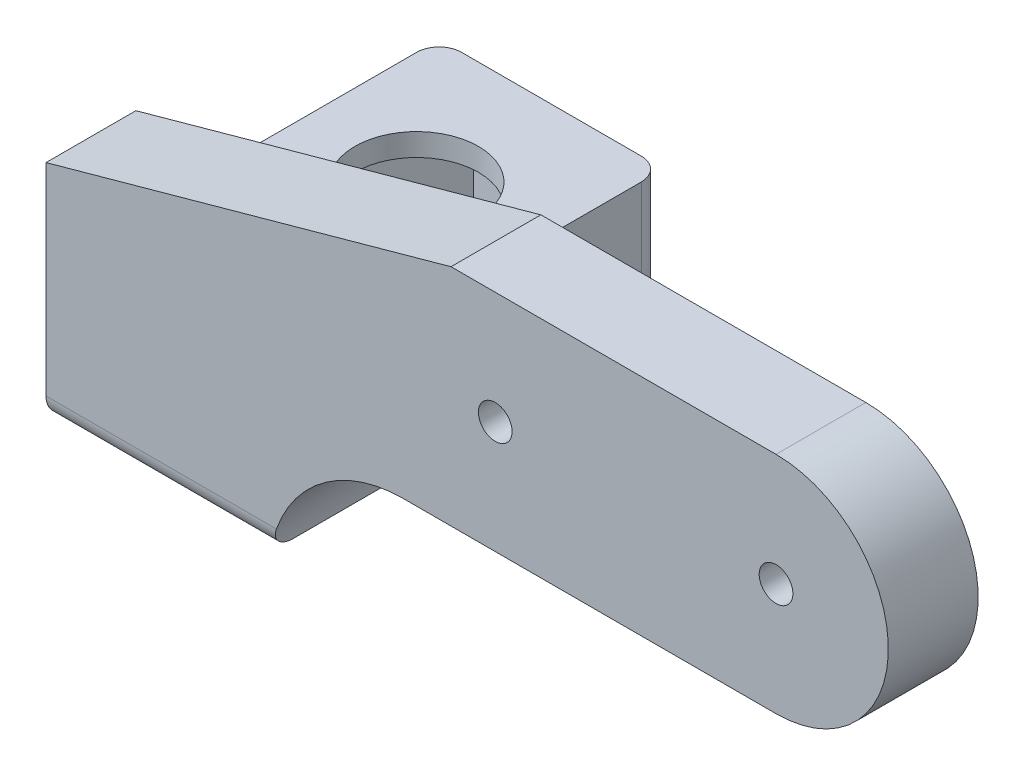
ISO-10303-21;
HEADER;
FILE_DESCRIPTION(('STEP AP214'),'2;1');
FILE_NAME('part.step','',(''),(''),'','','');
FILE_SCHEMA(('AUTOMOTIVE_DESIGN { 1 0 10303 214 1 1 1 1 }'));
ENDSEC;
DATA;
#1=APPLICATION_CONTEXT('core data for automotive mechanical design processes');
#2=APPLICATION_PROTOCOL_DEFINITION('international standard','automotive_design',2000,#1);
#3=PRODUCT_CONTEXT('',#1,'mechanical');
#4=PRODUCT('Part','Part','',(#3));
#5=PRODUCT_RELATED_PRODUCT_CATEGORY('part','',(#4));
#6=PRODUCT_DEFINITION_FORMATION('','',#4);
#7=PRODUCT_DEFINITION_CONTEXT('part definition',#1,'design');
#8=PRODUCT_DEFINITION('design','',#6,#7);
#9=PRODUCT_DEFINITION_SHAPE('','',#8);
#10=(LENGTH_UNIT() NAMED_UNIT(*) SI_UNIT(.MILLI.,.METRE.));
#11=(NAMED_UNIT(*) PLANE_ANGLE_UNIT() SI_UNIT($,.RADIAN.));
#12=(NAMED_UNIT(*) SI_UNIT($,.STERADIAN.) SOLID_ANGLE_UNIT());
#13=UNCERTAINTY_MEASURE_WITH_UNIT(LENGTH_MEASURE(1.E-05),#10,'distance_accuracy_value','');
#14=(GEOMETRIC_REPRESENTATION_CONTEXT(3) GLOBAL_UNCERTAINTY_ASSIGNED_CONTEXT((#13)) GLOBAL_UNIT_ASSIGNED_CONTEXT((#10,
#11,#12)) REPRESENTATION_CONTEXT('',''));
#15=CARTESIAN_POINT('',(0.,0.,0.));
#16=DIRECTION('',(0.,0.,1.));
#17=DIRECTION('',(1.,0.,0.));
#18=AXIS2_PLACEMENT_3D('',#15,#16,#17);
#19=CARTESIAN_POINT('',(40.,0.,0.));
#20=DIRECTION('',(0.,0.,1.));
#21=DIRECTION('',(1.,0.,0.));
#22=AXIS2_PLACEMENT_3D('',#19,#20,#21);
#23=PLANE('',#22);
#24=CARTESIAN_POINT('',(40.,0.,0.));
#25=DIRECTION('',(0.,0.,1.));
#26=DIRECTION('',(1.,0.,0.));
#27=AXIS2_PLACEMENT_3D('',#24,#25,#26);
#28=CIRCLE('',#27,1.5);
#29=CARTESIAN_POINT('',(41.5,0.,0.));
#30=VERTEX_POINT('',#29);
#31=EDGE_CURVE('E210',#30,#30,#28,.T.);
#32=ORIENTED_EDGE('',*,*,#31,.T.);
#33=EDGE_LOOP('',(#32));
#34=FACE_BOUND('',#33,.T.);
#35=CARTESIAN_POINT('',(15.,0.,0.));
#36=DIRECTION('',(0.,0.,-1.));
#37=DIRECTION('',(-1.,0.,0.));
#38=AXIS2_PLACEMENT_3D('',#35,#36,#37);
#39=CIRCLE('',#38,1.5);
#40=CARTESIAN_POINT('',(13.5,0.,0.));
#41=VERTEX_POINT('',#40);
#42=EDGE_CURVE('E320',#41,#41,#39,.T.);
#43=ORIENTED_EDGE('',*,*,#42,.F.);
#44=EDGE_LOOP('',(#43));
#45=FACE_BOUND('',#44,.T.);
#46=DIRECTION('',(0.,-1.,0.));
#47=VECTOR('',#46,1.);
#48=CARTESIAN_POINT('',(-25.,10.,0.));
#49=LINE('',#48,#47);
#50=CARTESIAN_POINT('',(-25.,0.,0.));
#51=VERTEX_POINT('',#50);
#52=CARTESIAN_POINT('',(-25.,-3.,0.));
#53=VERTEX_POINT('',#52);
#54=EDGE_CURVE('E207',#51,#53,#49,.T.);
#55=ORIENTED_EDGE('',*,*,#54,.F.);
#56=DIRECTION('',(0.963636466633251,0.267216691422118,0.));
#57=VECTOR('',#56,1.);
#58=CARTESIAN_POINT('',(35.3586905886521,16.7374836425835,0.));
#59=LINE('',#58,#57);
#60=CARTESIAN_POINT('',(11.061986304254,10.,0.));
#61=VERTEX_POINT('',#60);
#62=EDGE_CURVE('E192',#51,#61,#59,.T.);
#63=ORIENTED_EDGE('',*,*,#62,.T.);
#64=DIRECTION('',(-1.,0.,0.));
#65=VECTOR('',#64,1.);
#66=CARTESIAN_POINT('',(-25.,10.,0.));
#67=LINE('',#66,#65);
#68=CARTESIAN_POINT('',(40.,10.,0.));
#69=VERTEX_POINT('',#68);
#70=EDGE_CURVE('E191',#69,#61,#67,.T.);
#71=ORIENTED_EDGE('',*,*,#70,.F.);
#72=CARTESIAN_POINT('',(40.,0.,0.));
#73=DIRECTION('',(0.,0.,1.));
#74=DIRECTION('',(1.,0.,0.));
#75=AXIS2_PLACEMENT_3D('',#72,#73,#74);
#76=CIRCLE('',#75,10.);
#77=CARTESIAN_POINT('',(40.,-10.,0.));
#78=VERTEX_POINT('',#77);
#79=EDGE_CURVE('E212',#78,#69,#76,.T.);
#80=ORIENTED_EDGE('',*,*,#79,.F.);
#81=DIRECTION('',(1.,0.,0.));
#82=VECTOR('',#81,1.);
#83=CARTESIAN_POINT('',(-25.,-10.,0.));
#84=LINE('',#83,#82);
#85=CARTESIAN_POINT('',(6.83215956619923,-10.,0.));
#86=VERTEX_POINT('',#85);
#87=EDGE_CURVE('E209',#86,#78,#84,.T.);
#88=ORIENTED_EDGE('',*,*,#87,.F.);
#89=CARTESIAN_POINT('',(6.83215956619924,-22.,0.));
#90=DIRECTION('',(0.,0.,1.));
#91=DIRECTION('',(1.,0.,0.));
#92=AXIS2_PLACEMENT_3D('',#89,#90,#91);
#93=CIRCLE('',#92,12.);
#94=CARTESIAN_POINT('',(0.,-12.1348291620473,0.));
#95=VERTEX_POINT('',#94);
#96=EDGE_CURVE('E224',#86,#95,#93,.T.);
#97=ORIENTED_EDGE('',*,*,#96,.T.);
#98=DIRECTION('',(0.,-1.,0.));
#99=VECTOR('',#98,1.);
#100=CARTESIAN_POINT('',(0.,0.,0.));
#101=LINE('',#100,#99);
#102=CARTESIAN_POINT('',(0.,-3.,0.));
#103=VERTEX_POINT('',#102);
#104=EDGE_CURVE('E240',#95,#103,#101,.F.);
#105=ORIENTED_EDGE('',*,*,#104,.T.);
#106=DIRECTION('',(1.,0.,0.));
#107=VECTOR('',#106,1.);
#108=CARTESIAN_POINT('',(-25.,-3.,0.));
#109=LINE('',#108,#107);
#110=EDGE_CURVE('E237',#103,#53,#109,.F.);
#111=ORIENTED_EDGE('',*,*,#110,.T.);
#112=EDGE_LOOP('',(#55,#63,#71,#80,#88,#97,#105,#111));
#113=FACE_BOUND('',#112,.T.);
#114=ADVANCED_FACE('F33',(#34,#45,#113),#23,.F.);
#115=CARTESIAN_POINT('',(-25.,10.,8.));
#116=DIRECTION('',(1.,0.,0.));
#117=DIRECTION('',(0.,1.,0.));
#118=AXIS2_PLACEMENT_3D('',#115,#116,#117);
#119=PLANE('',#118);
#120=DIRECTION('',(0.,0.,1.));
#121=VECTOR('',#120,1.);
#122=CARTESIAN_POINT('',(-25.,-8.,-30.));
#123=LINE('',#122,#121);
#124=CARTESIAN_POINT('',(-25.,-8.,-25.));
#125=VERTEX_POINT('',#124);
#126=CARTESIAN_POINT('',(-25.,-8.,-5.));
#127=VERTEX_POINT('',#126);
#128=EDGE_CURVE('E314',#125,#127,#123,.T.);
#129=ORIENTED_EDGE('',*,*,#128,.F.);
#130=DIRECTION('',(0.,-1.,0.));
#131=VECTOR('',#130,1.);
#132=CARTESIAN_POINT('',(-25.,10.,-25.));
#133=LINE('',#132,#131);
#134=CARTESIAN_POINT('',(-25.,-20.,-25.));
#135=VERTEX_POINT('',#134);
#136=EDGE_CURVE('E11',#125,#135,#133,.T.);
#137=ORIENTED_EDGE('',*,*,#136,.T.);
#138=DIRECTION('',(0.,0.,-1.));
#139=VECTOR('',#138,1.);
#140=CARTESIAN_POINT('',(-25.,-20.,8.));
#141=LINE('',#140,#139);
#142=CARTESIAN_POINT('',(-25.,-20.,6.));
#143=VERTEX_POINT('',#142);
#144=EDGE_CURVE('E316',#143,#135,#141,.T.);
#145=ORIENTED_EDGE('',*,*,#144,.F.);
#146=CARTESIAN_POINT('',(-25.,-18.,6.));
#147=DIRECTION('',(1.,0.,0.));
#148=DIRECTION('',(0.,1.,0.));
#149=AXIS2_PLACEMENT_3D('',#146,#147,#148);
#150=CIRCLE('',#149,2.);
#151=CARTESIAN_POINT('',(-25.,-18.,8.));
#152=VERTEX_POINT('',#151);
#153=EDGE_CURVE('E630',#143,#152,#150,.F.);
#154=ORIENTED_EDGE('',*,*,#153,.T.);
#155=DIRECTION('',(0.,-1.,0.));
#156=VECTOR('',#155,1.);
#157=CARTESIAN_POINT('',(-25.,10.,8.));
#158=LINE('',#157,#156);
#159=CARTESIAN_POINT('',(-25.,0.,8.));
#160=VERTEX_POINT('',#159);
#161=EDGE_CURVE('E214',#160,#152,#158,.T.);
#162=ORIENTED_EDGE('',*,*,#161,.F.);
#163=DIRECTION('',(0.,0.,1.));
#164=VECTOR('',#163,1.);
#165=CARTESIAN_POINT('',(-25.,0.,-2.));
#166=LINE('',#165,#164);
#167=EDGE_CURVE('E178',#51,#160,#166,.T.);
#168=ORIENTED_EDGE('',*,*,#167,.F.);
#169=ORIENTED_EDGE('',*,*,#54,.T.);
#170=CARTESIAN_POINT('',(-25.,-3.,-5.));
#171=DIRECTION('',(1.,0.,0.));
#172=DIRECTION('',(0.,1.,0.));
#173=AXIS2_PLACEMENT_3D('',#170,#171,#172);
#174=CIRCLE('',#173,5.);
#175=EDGE_CURVE('E252',#53,#127,#174,.T.);
#176=ORIENTED_EDGE('',*,*,#175,.T.);
#177=EDGE_LOOP('',(#129,#137,#145,#154,#162,#168,#169,#176));
#178=FACE_BOUND('',#177,.T.);
#179=ADVANCED_FACE('F429',(#178),#119,.F.);
#180=CARTESIAN_POINT('',(-25.,-10.,8.));
#181=DIRECTION('',(0.,1.,0.));
#182=DIRECTION('',(0.,0.,1.));
#183=AXIS2_PLACEMENT_3D('',#180,#181,#182);
#184=PLANE('',#183);
#185=DIRECTION('',(1.,0.,0.));
#186=VECTOR('',#185,1.);
#187=CARTESIAN_POINT('',(-25.,-10.,8.));
#188=LINE('',#187,#186);
#189=CARTESIAN_POINT('',(6.83215956619923,-10.,8.));
#190=VERTEX_POINT('',#189);
#191=CARTESIAN_POINT('',(40.,-10.,8.));
#192=VERTEX_POINT('',#191);
#193=EDGE_CURVE('E203',#190,#192,#188,.T.);
#194=ORIENTED_EDGE('',*,*,#193,.F.);
#195=DIRECTION('',(0.,0.,-1.));
#196=VECTOR('',#195,1.);
#197=CARTESIAN_POINT('',(6.83215956619923,-10.,8.));
#198=LINE('',#197,#196);
#199=EDGE_CURVE('E218',#190,#86,#198,.T.);
#200=ORIENTED_EDGE('',*,*,#199,.T.);
#201=ORIENTED_EDGE('',*,*,#87,.T.);
#202=DIRECTION('',(0.,0.,-1.));
#203=VECTOR('',#202,1.);
#204=CARTESIAN_POINT('',(40.,-10.,8.));
#205=LINE('',#204,#203);
#206=EDGE_CURVE('E201',#192,#78,#205,.T.);
#207=ORIENTED_EDGE('',*,*,#206,.F.);
#208=EDGE_LOOP('',(#194,#200,#201,#207));
#209=FACE_BOUND('',#208,.T.);
#210=ADVANCED_FACE('F333',(#209),#184,.F.);
#211=CARTESIAN_POINT('',(40.,0.,8.));
#212=DIRECTION('',(0.,0.,-1.));
#213=DIRECTION('',(-1.,0.,0.));
#214=AXIS2_PLACEMENT_3D('',#211,#212,#213);
#215=CYLINDRICAL_SURFACE('',#214,10.);
#216=ORIENTED_EDGE('',*,*,#79,.T.);
#217=DIRECTION('',(0.,0.,-1.));
#218=VECTOR('',#217,1.);
#219=CARTESIAN_POINT('',(40.,10.,8.));
#220=LINE('',#219,#218);
#221=CARTESIAN_POINT('',(40.,10.,8.));
#222=VERTEX_POINT('',#221);
#223=EDGE_CURVE('E199',#222,#69,#220,.T.);
#224=ORIENTED_EDGE('',*,*,#223,.F.);
#225=CARTESIAN_POINT('',(40.,0.,8.));
#226=DIRECTION('',(0.,0.,1.));
#227=DIRECTION('',(1.,0.,0.));
#228=AXIS2_PLACEMENT_3D('',#225,#226,#227);
#229=CIRCLE('',#228,10.);
#230=EDGE_CURVE('E197',#192,#222,#229,.T.);
#231=ORIENTED_EDGE('',*,*,#230,.F.);
#232=ORIENTED_EDGE('',*,*,#206,.T.);
#233=EDGE_LOOP('',(#216,#224,#231,#232));
#234=FACE_BOUND('',#233,.T.);
#235=ADVANCED_FACE('F337',(#234),#215,.T.);
#236=CARTESIAN_POINT('',(-25.,10.,8.));
#237=DIRECTION('',(0.,-1.,0.));
#238=DIRECTION('',(0.,0.,-1.));
#239=AXIS2_PLACEMENT_3D('',#236,#237,#238);
#240=PLANE('',#239);
#241=ORIENTED_EDGE('',*,*,#70,.T.);
#242=DIRECTION('',(0.,0.,1.));
#243=VECTOR('',#242,1.);
#244=CARTESIAN_POINT('',(11.061986304254,10.,-2.));
#245=LINE('',#244,#243);
#246=CARTESIAN_POINT('',(11.061986304254,10.,8.));
#247=VERTEX_POINT('',#246);
#248=EDGE_CURVE('E175',#61,#247,#245,.T.);
#249=ORIENTED_EDGE('',*,*,#248,.T.);
#250=DIRECTION('',(-1.,0.,0.));
#251=VECTOR('',#250,1.);
#252=CARTESIAN_POINT('',(-25.,10.,8.));
#253=LINE('',#252,#251);
#254=EDGE_CURVE('E189',#222,#247,#253,.T.);
#255=ORIENTED_EDGE('',*,*,#254,.F.);
#256=ORIENTED_EDGE('',*,*,#223,.T.);
#257=EDGE_LOOP('',(#241,#249,#255,#256));
#258=FACE_BOUND('',#257,.T.);
#259=ADVANCED_FACE('F187',(#258),#240,.F.);
#260=CARTESIAN_POINT('',(40.,0.,8.));
#261=DIRECTION('',(0.,0.,1.));
#262=DIRECTION('',(1.,0.,0.));
#263=AXIS2_PLACEMENT_3D('',#260,#261,#262);
#264=PLANE('',#263);
#265=DIRECTION('',(0.963636466633251,0.267216691422118,0.));
#266=VECTOR('',#265,1.);
#267=CARTESIAN_POINT('',(-25.,0.,8.));
#268=LINE('',#267,#266);
#269=EDGE_CURVE('E172',#160,#247,#268,.T.);
#270=ORIENTED_EDGE('',*,*,#269,.F.);
#271=ORIENTED_EDGE('',*,*,#161,.T.);
#272=DIRECTION('',(-1.,0.,0.));
#273=VECTOR('',#272,1.);
#274=CARTESIAN_POINT('',(40.,-18.,8.));
#275=LINE('',#274,#273);
#276=CARTESIAN_POINT('',(-4.48154893278553,-18.,8.));
#277=VERTEX_POINT('',#276);
#278=EDGE_CURVE('E281',#152,#277,#275,.F.);
#279=ORIENTED_EDGE('',*,*,#278,.T.);
#280=CARTESIAN_POINT('',(6.83215956619924,-22.,8.));
#281=DIRECTION('',(0.,0.,1.));
#282=DIRECTION('',(1.,0.,0.));
#283=AXIS2_PLACEMENT_3D('',#280,#281,#282);
#284=CIRCLE('',#283,12.);
#285=EDGE_CURVE('E227',#277,#190,#284,.F.);
#286=ORIENTED_EDGE('',*,*,#285,.T.);
#287=ORIENTED_EDGE('',*,*,#193,.T.);
#288=ORIENTED_EDGE('',*,*,#230,.T.);
#289=ORIENTED_EDGE('',*,*,#254,.T.);
#290=EDGE_LOOP('',(#270,#271,#279,#286,#287,#288,#289));
#291=FACE_BOUND('',#290,.T.);
#292=CARTESIAN_POINT('',(15.,0.,8.));
#293=DIRECTION('',(0.,0.,1.));
#294=DIRECTION('',(1.,0.,0.));
#295=AXIS2_PLACEMENT_3D('',#292,#293,#294);
#296=CIRCLE('',#295,1.5);
#297=CARTESIAN_POINT('',(16.5,0.,8.));
#298=VERTEX_POINT('',#297);
#299=EDGE_CURVE('E323',#298,#298,#296,.T.);
#300=ORIENTED_EDGE('',*,*,#299,.F.);
#301=EDGE_LOOP('',(#300));
#302=FACE_BOUND('',#301,.T.);
#303=CARTESIAN_POINT('',(40.,0.,8.));
#304=DIRECTION('',(0.,0.,1.));
#305=DIRECTION('',(1.,0.,0.));
#306=AXIS2_PLACEMENT_3D('',#303,#304,#305);
#307=CIRCLE('',#306,1.5);
#308=CARTESIAN_POINT('',(41.5,0.,8.));
#309=VERTEX_POINT('',#308);
#310=EDGE_CURVE('E221',#309,#309,#307,.T.);
#311=ORIENTED_EDGE('',*,*,#310,.F.);
#312=EDGE_LOOP('',(#311));
#313=FACE_BOUND('',#312,.T.);
#314=ADVANCED_FACE('F194',(#291,#302,#313),#264,.T.);
#315=CARTESIAN_POINT('',(40.,0.,-2.));
#316=DIRECTION('',(0.,0.,1.));
#317=DIRECTION('',(1.,0.,0.));
#318=AXIS2_PLACEMENT_3D('',#315,#316,#317);
#319=CYLINDRICAL_SURFACE('',#318,1.5);
#320=ORIENTED_EDGE('',*,*,#310,.T.);
#321=EDGE_LOOP('',(#320));
#322=FACE_BOUND('',#321,.T.);
#323=ORIENTED_EDGE('',*,*,#31,.F.);
#324=EDGE_LOOP('',(#323));
#325=FACE_BOUND('',#324,.T.);
#326=ADVANCED_FACE('F472',(#322,#325),#319,.F.);
#327=CARTESIAN_POINT('',(15.,0.,10.));
#328=DIRECTION('',(0.,0.,-1.));
#329=DIRECTION('',(-1.,0.,0.));
#330=AXIS2_PLACEMENT_3D('',#327,#328,#329);
#331=CYLINDRICAL_SURFACE('',#330,1.5);
#332=ORIENTED_EDGE('',*,*,#299,.T.);
#333=EDGE_LOOP('',(#332));
#334=FACE_BOUND('',#333,.T.);
#335=ORIENTED_EDGE('',*,*,#42,.T.);
#336=EDGE_LOOP('',(#335));
#337=FACE_BOUND('',#336,.T.);
#338=ADVANCED_FACE('F481',(#334,#337),#331,.F.);
#339=CARTESIAN_POINT('',(-25.,-20.,8.));
#340=DIRECTION('',(0.,-1.,0.));
#341=DIRECTION('',(1.,0.,0.));
#342=AXIS2_PLACEMENT_3D('',#339,#340,#341);
#343=PLANE('',#342);
#344=DIRECTION('',(-1.,0.,0.));
#345=VECTOR('',#344,1.);
#346=CARTESIAN_POINT('',(-25.,-20.,-27.));
#347=LINE('',#346,#345);
#348=CARTESIAN_POINT('',(-7.,-20.,-27.));
#349=VERTEX_POINT('',#348);
#350=CARTESIAN_POINT('',(-23.,-20.,-27.));
#351=VERTEX_POINT('',#350);
#352=EDGE_CURVE('E182',#349,#351,#347,.T.);
#353=ORIENTED_EDGE('',*,*,#352,.F.);
#354=CARTESIAN_POINT('',(-7.,-20.,-25.));
#355=DIRECTION('',(0.,-1.,0.));
#356=DIRECTION('',(1.,0.,0.));
#357=AXIS2_PLACEMENT_3D('',#354,#355,#356);
#358=CIRCLE('',#357,2.);
#359=CARTESIAN_POINT('',(-5.,-20.,-25.));
#360=VERTEX_POINT('',#359);
#361=EDGE_CURVE('E291',#349,#360,#358,.T.);
#362=ORIENTED_EDGE('',*,*,#361,.T.);
#363=DIRECTION('',(0.,0.,-1.));
#364=VECTOR('',#363,1.);
#365=CARTESIAN_POINT('',(-5.,-20.,8.));
#366=LINE('',#365,#364);
#367=CARTESIAN_POINT('',(-5.,-20.,-5.));
#368=VERTEX_POINT('',#367);
#369=EDGE_CURVE('E310',#368,#360,#366,.T.);
#370=ORIENTED_EDGE('',*,*,#369,.F.);
#371=CARTESIAN_POINT('',(-5.,-20.,6.));
#372=VERTEX_POINT('',#371);
#373=EDGE_CURVE('E313',#372,#368,#366,.T.);
#374=ORIENTED_EDGE('',*,*,#373,.F.);
#375=DIRECTION('',(-1.,0.,0.));
#376=VECTOR('',#375,1.);
#377=CARTESIAN_POINT('',(-25.,-20.,6.));
#378=LINE('',#377,#376);
#379=EDGE_CURVE('E628',#372,#143,#378,.T.);
#380=ORIENTED_EDGE('',*,*,#379,.T.);
#381=ORIENTED_EDGE('',*,*,#144,.T.);
#382=CARTESIAN_POINT('',(-23.,-20.,-25.));
#383=DIRECTION('',(0.,-1.,0.));
#384=DIRECTION('',(1.,0.,0.));
#385=AXIS2_PLACEMENT_3D('',#382,#383,#384);
#386=CIRCLE('',#385,2.);
#387=EDGE_CURVE('E289',#135,#351,#386,.T.);
#388=ORIENTED_EDGE('',*,*,#387,.T.);
#389=EDGE_LOOP('',(#353,#362,#370,#374,#380,#381,#388));
#390=FACE_BOUND('',#389,.T.);
#391=DIRECTION('',(-0.642787609686542,0.,0.766044443118976));
#392=VECTOR('',#391,1.);
#393=CARTESIAN_POINT('',(-6.62913409939624,-20.,-13.5239904898311));
#394=LINE('',#393,#392);
#395=CARTESIAN_POINT('',(-6.62913409939624,-20.,-13.5239904898311));
#396=VERTEX_POINT('',#395);
#397=CARTESIAN_POINT('',(-12.0928287817318,-20.,-7.01261272331977));
#398=VERTEX_POINT('',#397);
#399=EDGE_CURVE('E233',#396,#398,#394,.T.);
#400=ORIENTED_EDGE('',*,*,#399,.F.);
#401=DIRECTION('',(0.342020143325665,0.,0.93969262078591));
#402=VECTOR('',#401,1.);
#403=CARTESIAN_POINT('',(-9.5363053176644,-20.,-21.5113777665113));
#404=LINE('',#403,#402);
#405=CARTESIAN_POINT('',(-9.5363053176644,-20.,-21.5113777665113));
#406=VERTEX_POINT('',#405);
#407=EDGE_CURVE('E351',#406,#396,#404,.T.);
#408=ORIENTED_EDGE('',*,*,#407,.F.);
#409=DIRECTION('',(0.984807753012208,0.,0.173648177666933));
#410=VECTOR('',#409,1.);
#411=CARTESIAN_POINT('',(-17.9071712182682,-20.,-22.9873872766802));
#412=LINE('',#411,#410);
#413=CARTESIAN_POINT('',(-17.9071712182682,-20.,-22.9873872766802));
#414=VERTEX_POINT('',#413);
#415=EDGE_CURVE('E377',#414,#406,#412,.T.);
#416=ORIENTED_EDGE('',*,*,#415,.F.);
#417=DIRECTION('',(0.642787609686542,0.,-0.766044443118976));
#418=VECTOR('',#417,1.);
#419=CARTESIAN_POINT('',(-23.3708659006038,-20.,-16.4760095101689));
#420=LINE('',#419,#418);
#421=CARTESIAN_POINT('',(-23.3708659006038,-20.,-16.4760095101689));
#422=VERTEX_POINT('',#421);
#423=EDGE_CURVE('E374',#422,#414,#420,.T.);
#424=ORIENTED_EDGE('',*,*,#423,.F.);
#425=DIRECTION('',(-0.342020143325665,0.,-0.939692620785909));
#426=VECTOR('',#425,1.);
#427=CARTESIAN_POINT('',(-20.4636946823356,-20.,-8.4886222334887));
#428=LINE('',#427,#426);
#429=CARTESIAN_POINT('',(-20.4636946823356,-20.,-8.4886222334887));
#430=VERTEX_POINT('',#429);
#431=EDGE_CURVE('E371',#430,#422,#428,.T.);
#432=ORIENTED_EDGE('',*,*,#431,.F.);
#433=DIRECTION('',(-0.984807753012207,0.,-0.173648177666934));
#434=VECTOR('',#433,1.);
#435=CARTESIAN_POINT('',(-12.0928287817318,-20.,-7.01261272331977));
#436=LINE('',#435,#434);
#437=EDGE_CURVE('E368',#398,#430,#436,.T.);
#438=ORIENTED_EDGE('',*,*,#437,.F.);
#439=EDGE_LOOP('',(#400,#408,#416,#424,#432,#438));
#440=FACE_BOUND('',#439,.T.);
#441=ADVANCED_FACE('F307',(#390,#440),#343,.T.);
#442=CARTESIAN_POINT('',(-5.,-10.,8.));
#443=DIRECTION('',(1.,0.,0.));
#444=DIRECTION('',(0.,0.,-1.));
#445=AXIS2_PLACEMENT_3D('',#442,#443,#444);
#446=PLANE('',#445);
#447=ORIENTED_EDGE('',*,*,#369,.T.);
#448=DIRECTION('',(0.,-1.,0.));
#449=VECTOR('',#448,1.);
#450=CARTESIAN_POINT('',(-5.,-8.,-25.));
#451=LINE('',#450,#449);
#452=CARTESIAN_POINT('',(-5.,-8.,-25.));
#453=VERTEX_POINT('',#452);
#454=EDGE_CURVE('E56',#360,#453,#451,.F.);
#455=ORIENTED_EDGE('',*,*,#454,.T.);
#456=DIRECTION('',(0.,0.,-1.));
#457=VECTOR('',#456,1.);
#458=CARTESIAN_POINT('',(-5.,-8.,-30.));
#459=LINE('',#458,#457);
#460=CARTESIAN_POINT('',(-5.,-8.,-5.));
#461=VERTEX_POINT('',#460);
#462=EDGE_CURVE('E297',#461,#453,#459,.T.);
#463=ORIENTED_EDGE('',*,*,#462,.F.);
#464=DIRECTION('',(0.,-1.,0.));
#465=VECTOR('',#464,1.);
#466=CARTESIAN_POINT('',(-5.,-10.,-5.));
#467=LINE('',#466,#465);
#468=EDGE_CURVE('E229',#461,#368,#467,.T.);
#469=ORIENTED_EDGE('',*,*,#468,.T.);
#470=EDGE_LOOP('',(#447,#455,#463,#469));
#471=FACE_BOUND('',#470,.T.);
#472=ADVANCED_FACE('F311',(#471),#446,.T.);
#473=CARTESIAN_POINT('',(6.83215956619924,-22.,8.));
#474=DIRECTION('',(0.,0.,-1.));
#475=DIRECTION('',(-1.,0.,0.));
#476=AXIS2_PLACEMENT_3D('',#473,#474,#475);
#477=CYLINDRICAL_SURFACE('',#476,12.);
#478=ORIENTED_EDGE('',*,*,#285,.F.);
#479=CARTESIAN_POINT('',(-4.48154893278553,-18.,8.));
#480=CARTESIAN_POINT('',(-4.50138125313948,-18.0560877717623,7.99999832305192));
#481=CARTESIAN_POINT('',(-4.52078424019849,-18.1123031979097,7.99763882394037));
#482=CARTESIAN_POINT('',(-4.55864154941412,-18.2246643135857,7.98814251719226));
#483=CARTESIAN_POINT('',(-4.57709563531679,-18.2808099823833,7.98100452596653));
#484=CARTESIAN_POINT('',(-4.63089238189496,-18.4486356009318,7.95232807713334));
#485=CARTESIAN_POINT('',(-4.66466130278686,-18.559680833343,7.92352709442766));
#486=CARTESIAN_POINT('',(-4.72735408814331,-18.7765785860345,7.84667328021879));
#487=CARTESIAN_POINT('',(-4.7562683096932,-18.8824204829235,7.79858276083968));
#488=CARTESIAN_POINT('',(-4.80888524868177,-19.0850345721453,7.68410594838005));
#489=CARTESIAN_POINT('',(-4.8325930659608,-19.1818155860983,7.61773770389394));
#490=CARTESIAN_POINT('',(-4.87405212171451,-19.3594265529934,7.47129257380848));
#491=CARTESIAN_POINT('',(-4.89199696991578,-19.4407259787916,7.39183921718088));
#492=CARTESIAN_POINT('',(-4.92339777930131,-19.5890591318635,7.21975075455985));
#493=CARTESIAN_POINT('',(-4.93685253648592,-19.6560890310796,7.12711212247243));
#494=CARTESIAN_POINT('',(-4.95935046191041,-19.772062493677,6.93390339662555));
#495=CARTESIAN_POINT('',(-4.96849692689365,-19.8214219011766,6.83359426728588));
#496=CARTESIAN_POINT('',(-4.98322858152512,-19.902781623108,6.62596324805298));
#497=CARTESIAN_POINT('',(-4.98881654519301,-19.9347954563216,6.51864689275829));
#498=CARTESIAN_POINT('',(-4.99519390458775,-19.9717226972868,6.34212747261345));
#499=CARTESIAN_POINT('',(-4.99700177862493,-19.9823210790566,6.27409656410973));
#500=CARTESIAN_POINT('',(-4.99940140648305,-19.9964577732676,6.13738714644132));
#501=CARTESIAN_POINT('',(-4.99999497922922,-20.0000066450736,6.06870976091195));
#502=CARTESIAN_POINT('',(-5.,-20.,6.));
#503=B_SPLINE_CURVE_WITH_KNOTS('',3,(#479,#480,#481,#482,#483,#484,#485,#486,#487,#488,#489,
#490,#491,#492,#493,#494,#495,#496,#497,#498,#499,#500,#501,#502),.UNSPECIFIED.,.F.,.F.,(4,2,2,
2,2,2,2,2,2,2,2,4),(0.,0.17837527524822,0.356794748790082,0.713707003854084,1.07132001712111,
1.42858115883977,1.7721376621222,2.11578621480146,2.45071320477386,2.78537878270886,
2.99165964856607,3.19763129543271),.UNSPECIFIED.);
#504=EDGE_CURVE('E273',#277,#372,#503,.T.);
#505=ORIENTED_EDGE('',*,*,#504,.T.);
#506=ORIENTED_EDGE('',*,*,#373,.T.);
#507=CARTESIAN_POINT('',(-5.,-20.,-5.));
#508=CARTESIAN_POINT('',(-5.00002983071516,-20.0002423652182,-4.94276954902935));
#509=CARTESIAN_POINT('',(-4.99901934267985,-19.9941907321539,-4.88595530761524));
#510=CARTESIAN_POINT('',(-4.99525039157633,-19.9720554020881,-4.77555185338585));
#511=CARTESIAN_POINT('',(-4.99252898286227,-19.9561844798837,-4.72192001648874));
#512=CARTESIAN_POINT('',(-4.98408791010207,-19.90785267169,-4.59418000961095));
#513=CARTESIAN_POINT('',(-4.97756841164664,-19.8711330466681,-4.52180614517529));
#514=CARTESIAN_POINT('',(-4.96223202410665,-19.7877219107002,-4.3825808930968));
#515=CARTESIAN_POINT('',(-4.95339017335325,-19.7409231136344,-4.31580059752893));
#516=CARTESIAN_POINT('',(-4.92774697062384,-19.6101574112571,-4.14638742167474));
#517=CARTESIAN_POINT('',(-4.90944657037671,-19.5213908358724,-4.04776496875074));
#518=CARTESIAN_POINT('',(-4.86890013634191,-19.336487127318,-3.85845009250445));
#519=CARTESIAN_POINT('',(-4.8466436889024,-19.2403309309494,-3.76777956580897));
#520=CARTESIAN_POINT('',(-4.79843003565541,-19.0437085450451,-3.59166124125073));
#521=CARTESIAN_POINT('',(-4.7724617061297,-18.9432300591574,-3.50623028658098));
#522=CARTESIAN_POINT('',(-4.71703917712112,-18.7400762924599,-3.33950703775577));
#523=CARTESIAN_POINT('',(-4.68758913168601,-18.6374037469055,-3.2582099738707));
#524=CARTESIAN_POINT('',(-4.61901325405676,-18.4100985902356,-3.08290445499588));
#525=CARTESIAN_POINT('',(-4.57912825037921,-18.2851624051574,-2.98958644310515));
#526=CARTESIAN_POINT('',(-4.49437716998494,-18.034255935153,-2.80666530000505));
#527=CARTESIAN_POINT('',(-4.44951033121737,-17.9082854947577,-2.71706274002012));
#528=CARTESIAN_POINT('',(-4.30730488015702,-17.5295368759611,-2.4530012696897));
#529=CARTESIAN_POINT('',(-4.2024203561827,-17.2761195498434,-2.28343795798222));
#530=CARTESIAN_POINT('',(-3.9722913836724,-16.7711556777164,-1.95686688191674));
#531=CARTESIAN_POINT('',(-3.84708080936692,-16.5196067351079,-1.79983886555038));
#532=CARTESIAN_POINT('',(-3.57558827900187,-16.0200735556958,-1.49911766184629));
#533=CARTESIAN_POINT('',(-3.4293185993765,-15.7720873339923,-1.35541678512763));
#534=CARTESIAN_POINT('',(-3.14961065204293,-15.335473435628,-1.11332897815827));
#535=CARTESIAN_POINT('',(-3.0204258322933,-15.1457864250495,-1.01192702679406));
#536=CARTESIAN_POINT('',(-2.7485294155333,-14.7706115192609,-0.819893533912961));
#537=CARTESIAN_POINT('',(-2.60581660491877,-14.5851240026428,-0.729262960349702));
#538=CARTESIAN_POINT('',(-2.30728539567637,-14.2201589955088,-0.560890363369335));
#539=CARTESIAN_POINT('',(-2.15151761366808,-14.0406617508639,-0.483101744511609));
#540=CARTESIAN_POINT('',(-1.82648848948985,-13.6882485401282,-0.342179324884258));
#541=CARTESIAN_POINT('',(-1.65723183331395,-13.5153303190805,-0.279040464390576));
#542=CARTESIAN_POINT('',(-1.36841508496078,-13.2378560430232,-0.189444479936658));
#543=CARTESIAN_POINT('',(-1.25267734182957,-13.1309270879083,-0.157938067629622));
#544=CARTESIAN_POINT('',(-1.01604778268768,-12.9208668537399,-0.102817284378438));
#545=CARTESIAN_POINT('',(-0.895157979504437,-12.8177341203861,-0.0791998626316512));
#546=CARTESIAN_POINT('',(-0.647824429568627,-12.6151449323776,-0.0405569345325324));
#547=CARTESIAN_POINT('',(-0.521353323286093,-12.5157123550073,-0.0255803859630951));
#548=CARTESIAN_POINT('',(-0.263900565394985,-12.32156759435,-0.00529847183239202));
#549=CARTESIAN_POINT('',(-0.132914578924757,-12.2268601740619,-2.6803381606355E-06));
#550=CARTESIAN_POINT('',(0.,-12.1348291620473,0.));
#551=B_SPLINE_CURVE_WITH_KNOTS('',3,(#507,#508,#509,#510,#511,#512,#513,#514,#515,#516,#517,
#518,#519,#520,#521,#522,#523,#524,#525,#526,#527,#528,#529,#530,#531,#532,#533,#534,#535,#536,
#537,#538,#539,#540,#541,#542,#543,#544,#545,#546,#547,#548,#549,#550),.UNSPECIFIED.,.F.,.F.,(4,
2,2,2,2,2,2,2,2,2,2,2,2,2,2,2,2,2,2,2,2,4),(0.,0.170703151596656,0.337830952092287,
0.580693490649767,0.826281587637511,1.22705914658555,1.62890774734898,2.03198688396057,
2.43458986869146,2.91732242315391,3.40012892122403,4.3665052326105,5.33128726545324,
6.29550913757507,7.04766010365497,7.79987860962329,8.54930476127781,9.29847169003779,
9.78026574132661,10.2618732586285,10.7461833470875,11.2309721495371),.UNSPECIFIED.);
#552=EDGE_CURVE('E244',#368,#95,#551,.T.);
#553=ORIENTED_EDGE('',*,*,#552,.T.);
#554=ORIENTED_EDGE('',*,*,#96,.F.);
#555=ORIENTED_EDGE('',*,*,#199,.F.);
#556=EDGE_LOOP('',(#478,#505,#506,#553,#554,#555));
#557=FACE_BOUND('',#556,.T.);
#558=ADVANCED_FACE('F254',(#557),#477,.F.);
#559=CARTESIAN_POINT('',(0.,-8.,0.));
#560=DIRECTION('',(0.,-1.,0.));
#561=DIRECTION('',(1.,0.,0.));
#562=AXIS2_PLACEMENT_3D('',#559,#560,#561);
#563=PLANE('',#562);
#564=CARTESIAN_POINT('',(-15.,-8.,-15.));
#565=DIRECTION('',(0.,-1.,0.));
#566=DIRECTION('',(1.,0.,0.));
#567=AXIS2_PLACEMENT_3D('',#564,#565,#566);
#568=CIRCLE('',#567,5.5);
#569=CARTESIAN_POINT('',(-9.5,-8.,-15.));
#570=VERTEX_POINT('',#569);
#571=EDGE_CURVE('E230',#570,#570,#568,.T.);
#572=ORIENTED_EDGE('',*,*,#571,.T.);
#573=EDGE_LOOP('',(#572));
#574=FACE_BOUND('',#573,.T.);
#575=ORIENTED_EDGE('',*,*,#462,.T.);
#576=CARTESIAN_POINT('',(-7.,-8.,-25.));
#577=DIRECTION('',(0.,-1.,0.));
#578=DIRECTION('',(1.,0.,0.));
#579=AXIS2_PLACEMENT_3D('',#576,#577,#578);
#580=CIRCLE('',#579,2.);
#581=CARTESIAN_POINT('',(-7.,-8.,-27.));
#582=VERTEX_POINT('',#581);
#583=EDGE_CURVE('E41',#453,#582,#580,.F.);
#584=ORIENTED_EDGE('',*,*,#583,.T.);
#585=DIRECTION('',(-1.,0.,0.));
#586=VECTOR('',#585,1.);
#587=CARTESIAN_POINT('',(0.,-8.,-27.));
#588=LINE('',#587,#586);
#589=CARTESIAN_POINT('',(-23.,-8.,-27.));
#590=VERTEX_POINT('',#589);
#591=EDGE_CURVE('E280',#582,#590,#588,.T.);
#592=ORIENTED_EDGE('',*,*,#591,.T.);
#593=CARTESIAN_POINT('',(-23.,-8.,-25.));
#594=DIRECTION('',(0.,-1.,0.));
#595=DIRECTION('',(1.,0.,0.));
#596=AXIS2_PLACEMENT_3D('',#593,#594,#595);
#597=CIRCLE('',#596,2.);
#598=EDGE_CURVE('E48',#590,#125,#597,.F.);
#599=ORIENTED_EDGE('',*,*,#598,.T.);
#600=ORIENTED_EDGE('',*,*,#128,.T.);
#601=DIRECTION('',(1.,0.,0.));
#602=VECTOR('',#601,1.);
#603=CARTESIAN_POINT('',(-5.,-8.,-5.));
#604=LINE('',#603,#602);
#605=EDGE_CURVE('E242',#127,#461,#604,.T.);
#606=ORIENTED_EDGE('',*,*,#605,.T.);
#607=EDGE_LOOP('',(#575,#584,#592,#599,#600,#606));
#608=FACE_BOUND('',#607,.T.);
#609=ADVANCED_FACE('F296',(#574,#608),#563,.F.);
#610=CARTESIAN_POINT('',(-6.62913409939624,-10.,-13.5239904898311));
#611=DIRECTION('',(0.766044443118976,0.,0.642787609686542));
#612=DIRECTION('',(0.642787609686542,0.,-0.766044443118976));
#613=AXIS2_PLACEMENT_3D('',#610,#611,#612);
#614=PLANE('',#613);
#615=ORIENTED_EDGE('',*,*,#399,.T.);
#616=DIRECTION('',(0.,-1.,0.));
#617=VECTOR('',#616,1.);
#618=CARTESIAN_POINT('',(-12.0928287817318,-10.,-7.01261272331977));
#619=LINE('',#618,#617);
#620=CARTESIAN_POINT('',(-12.0928287817318,-10.,-7.01261272331977));
#621=VERTEX_POINT('',#620);
#622=EDGE_CURVE('E366',#621,#398,#619,.T.);
#623=ORIENTED_EDGE('',*,*,#622,.F.);
#624=DIRECTION('',(-0.642787609686542,0.,0.766044443118976));
#625=VECTOR('',#624,1.);
#626=CARTESIAN_POINT('',(-6.62913409939624,-10.,-13.5239904898311));
#627=LINE('',#626,#625);
#628=CARTESIAN_POINT('',(-6.62913409939624,-10.,-13.5239904898311));
#629=VERTEX_POINT('',#628);
#630=EDGE_CURVE('E347',#629,#621,#627,.T.);
#631=ORIENTED_EDGE('',*,*,#630,.F.);
#632=DIRECTION('',(0.,-1.,0.));
#633=VECTOR('',#632,1.);
#634=CARTESIAN_POINT('',(-6.62913409939624,-10.,-13.5239904898311));
#635=LINE('',#634,#633);
#636=EDGE_CURVE('E382',#629,#396,#635,.T.);
#637=ORIENTED_EDGE('',*,*,#636,.T.);
#638=EDGE_LOOP('',(#615,#623,#631,#637));
#639=FACE_BOUND('',#638,.T.);
#640=ADVANCED_FACE('F412',(#639),#614,.F.);
#641=CARTESIAN_POINT('',(-9.53630531766439,-10.,-21.5113777665113));
#642=DIRECTION('',(0.93969262078591,0.,-0.342020143325665));
#643=DIRECTION('',(-0.342020143325665,0.,-0.93969262078591));
#644=AXIS2_PLACEMENT_3D('',#641,#642,#643);
#645=PLANE('',#644);
#646=ORIENTED_EDGE('',*,*,#407,.T.);
#647=ORIENTED_EDGE('',*,*,#636,.F.);
#648=DIRECTION('',(0.342020143325665,0.,0.93969262078591));
#649=VECTOR('',#648,1.);
#650=CARTESIAN_POINT('',(-9.53630531766439,-10.,-21.5113777665113));
#651=LINE('',#650,#649);
#652=CARTESIAN_POINT('',(-9.53630531766439,-10.,-21.5113777665113));
#653=VERTEX_POINT('',#652);
#654=EDGE_CURVE('E363',#653,#629,#651,.T.);
#655=ORIENTED_EDGE('',*,*,#654,.F.);
#656=DIRECTION('',(0.,-1.,0.));
#657=VECTOR('',#656,1.);
#658=CARTESIAN_POINT('',(-9.53630531766439,-10.,-21.5113777665113));
#659=LINE('',#658,#657);
#660=EDGE_CURVE('E384',#653,#406,#659,.T.);
#661=ORIENTED_EDGE('',*,*,#660,.T.);
#662=EDGE_LOOP('',(#646,#647,#655,#661));
#663=FACE_BOUND('',#662,.T.);
#664=ADVANCED_FACE('F414',(#663),#645,.F.);
#665=CARTESIAN_POINT('',(-17.9071712182682,-10.,-22.9873872766802));
#666=DIRECTION('',(0.173648177666933,0.,-0.984807753012208));
#667=DIRECTION('',(-0.984807753012208,0.,-0.173648177666933));
#668=AXIS2_PLACEMENT_3D('',#665,#666,#667);
#669=PLANE('',#668);
#670=ORIENTED_EDGE('',*,*,#415,.T.);
#671=ORIENTED_EDGE('',*,*,#660,.F.);
#672=DIRECTION('',(0.984807753012208,0.,0.173648177666933));
#673=VECTOR('',#672,1.);
#674=CARTESIAN_POINT('',(-17.9071712182682,-10.,-22.9873872766802));
#675=LINE('',#674,#673);
#676=CARTESIAN_POINT('',(-17.9071712182682,-10.,-22.9873872766802));
#677=VERTEX_POINT('',#676);
#678=EDGE_CURVE('E360',#677,#653,#675,.T.);
#679=ORIENTED_EDGE('',*,*,#678,.F.);
#680=DIRECTION('',(0.,-1.,0.));
#681=VECTOR('',#680,1.);
#682=CARTESIAN_POINT('',(-17.9071712182682,-10.,-22.9873872766802));
#683=LINE('',#682,#681);
#684=EDGE_CURVE('E386',#677,#414,#683,.T.);
#685=ORIENTED_EDGE('',*,*,#684,.T.);
#686=EDGE_LOOP('',(#670,#671,#679,#685));
#687=FACE_BOUND('',#686,.T.);
#688=ADVANCED_FACE('F416',(#687),#669,.F.);
#689=CARTESIAN_POINT('',(-23.3708659006038,-10.,-16.4760095101689));
#690=DIRECTION('',(-0.766044443118976,0.,-0.642787609686542));
#691=DIRECTION('',(-0.642787609686542,0.,0.766044443118976));
#692=AXIS2_PLACEMENT_3D('',#689,#690,#691);
#693=PLANE('',#692);
#694=ORIENTED_EDGE('',*,*,#423,.T.);
#695=ORIENTED_EDGE('',*,*,#684,.F.);
#696=DIRECTION('',(0.642787609686542,0.,-0.766044443118976));
#697=VECTOR('',#696,1.);
#698=CARTESIAN_POINT('',(-23.3708659006038,-10.,-16.4760095101689));
#699=LINE('',#698,#697);
#700=CARTESIAN_POINT('',(-23.3708659006038,-10.,-16.4760095101689));
#701=VERTEX_POINT('',#700);
#702=EDGE_CURVE('E357',#701,#677,#699,.T.);
#703=ORIENTED_EDGE('',*,*,#702,.F.);
#704=DIRECTION('',(0.,-1.,0.));
#705=VECTOR('',#704,1.);
#706=CARTESIAN_POINT('',(-23.3708659006038,-10.,-16.4760095101689));
#707=LINE('',#706,#705);
#708=EDGE_CURVE('E388',#701,#422,#707,.T.);
#709=ORIENTED_EDGE('',*,*,#708,.T.);
#710=EDGE_LOOP('',(#694,#695,#703,#709));
#711=FACE_BOUND('',#710,.T.);
#712=ADVANCED_FACE('F419',(#711),#693,.F.);
#713=CARTESIAN_POINT('',(-20.4636946823356,-10.,-8.4886222334887));
#714=DIRECTION('',(-0.93969262078591,0.,0.342020143325665));
#715=DIRECTION('',(0.342020143325665,0.,0.93969262078591));
#716=AXIS2_PLACEMENT_3D('',#713,#714,#715);
#717=PLANE('',#716);
#718=ORIENTED_EDGE('',*,*,#431,.T.);
#719=ORIENTED_EDGE('',*,*,#708,.F.);
#720=DIRECTION('',(-0.342020143325665,0.,-0.939692620785909));
#721=VECTOR('',#720,1.);
#722=CARTESIAN_POINT('',(-20.4636946823356,-10.,-8.4886222334887));
#723=LINE('',#722,#721);
#724=CARTESIAN_POINT('',(-20.4636946823356,-10.,-8.4886222334887));
#725=VERTEX_POINT('',#724);
#726=EDGE_CURVE('E354',#725,#701,#723,.T.);
#727=ORIENTED_EDGE('',*,*,#726,.F.);
#728=DIRECTION('',(0.,-1.,0.));
#729=VECTOR('',#728,1.);
#730=CARTESIAN_POINT('',(-20.4636946823356,-10.,-8.4886222334887));
#731=LINE('',#730,#729);
#732=EDGE_CURVE('E390',#725,#430,#731,.T.);
#733=ORIENTED_EDGE('',*,*,#732,.T.);
#734=EDGE_LOOP('',(#718,#719,#727,#733));
#735=FACE_BOUND('',#734,.T.);
#736=ADVANCED_FACE('F406',(#735),#717,.F.);
#737=CARTESIAN_POINT('',(-12.0928287817318,-10.,-7.01261272331977));
#738=DIRECTION('',(-0.173648177666934,0.,0.984807753012207));
#739=DIRECTION('',(0.984807753012207,0.,0.173648177666934));
#740=AXIS2_PLACEMENT_3D('',#737,#738,#739);
#741=PLANE('',#740);
#742=ORIENTED_EDGE('',*,*,#437,.T.);
#743=ORIENTED_EDGE('',*,*,#732,.F.);
#744=DIRECTION('',(-0.984807753012207,0.,-0.173648177666934));
#745=VECTOR('',#744,1.);
#746=CARTESIAN_POINT('',(-12.0928287817318,-10.,-7.01261272331977));
#747=LINE('',#746,#745);
#748=EDGE_CURVE('E350',#621,#725,#747,.T.);
#749=ORIENTED_EDGE('',*,*,#748,.F.);
#750=ORIENTED_EDGE('',*,*,#622,.T.);
#751=EDGE_LOOP('',(#742,#743,#749,#750));
#752=FACE_BOUND('',#751,.T.);
#753=ADVANCED_FACE('F397',(#752),#741,.F.);
#754=CARTESIAN_POINT('',(0.,-10.,0.));
#755=DIRECTION('',(0.,-1.,0.));
#756=DIRECTION('',(0.,0.,-1.));
#757=AXIS2_PLACEMENT_3D('',#754,#755,#756);
#758=PLANE('',#757);
#759=CARTESIAN_POINT('',(-15.,-10.,-15.));
#760=DIRECTION('',(0.,-1.,0.));
#761=DIRECTION('',(0.,0.,-1.));
#762=AXIS2_PLACEMENT_3D('',#759,#760,#761);
#763=CIRCLE('',#762,5.5);
#764=CARTESIAN_POINT('',(-15.,-10.,-20.5));
#765=VERTEX_POINT('',#764);
#766=EDGE_CURVE('E234',#765,#765,#763,.T.);
#767=ORIENTED_EDGE('',*,*,#766,.F.);
#768=EDGE_LOOP('',(#767));
#769=FACE_BOUND('',#768,.T.);
#770=ORIENTED_EDGE('',*,*,#630,.T.);
#771=ORIENTED_EDGE('',*,*,#748,.T.);
#772=ORIENTED_EDGE('',*,*,#726,.T.);
#773=ORIENTED_EDGE('',*,*,#702,.T.);
#774=ORIENTED_EDGE('',*,*,#678,.T.);
#775=ORIENTED_EDGE('',*,*,#654,.T.);
#776=EDGE_LOOP('',(#770,#771,#772,#773,#774,#775));
#777=FACE_BOUND('',#776,.T.);
#778=ADVANCED_FACE('F410',(#769,#777),#758,.T.);
#779=CARTESIAN_POINT('',(-15.,0.,-15.));
#780=DIRECTION('',(0.,-1.,0.));
#781=DIRECTION('',(0.,0.,-1.));
#782=AXIS2_PLACEMENT_3D('',#779,#780,#781);
#783=CYLINDRICAL_SURFACE('',#782,5.5);
#784=ORIENTED_EDGE('',*,*,#766,.T.);
#785=EDGE_LOOP('',(#784));
#786=FACE_BOUND('',#785,.T.);
#787=ORIENTED_EDGE('',*,*,#571,.F.);
#788=EDGE_LOOP('',(#787));
#789=FACE_BOUND('',#788,.T.);
#790=ADVANCED_FACE('F266',(#786,#789),#783,.F.);
#791=CARTESIAN_POINT('',(0.,-3.,-5.));
#792=DIRECTION('',(-1.,0.,0.));
#793=DIRECTION('',(0.,-1.,0.));
#794=AXIS2_PLACEMENT_3D('',#791,#792,#793);
#795=CYLINDRICAL_SURFACE('',#794,5.);
#796=ORIENTED_EDGE('',*,*,#175,.F.);
#797=ORIENTED_EDGE('',*,*,#110,.F.);
#798=CARTESIAN_POINT('',(0.,-3.,-5.));
#799=DIRECTION('',(-0.707106781186547,0.707106781186547,0.));
#800=DIRECTION('',(-0.707106781186548,-0.707106781186547,0.));
#801=AXIS2_PLACEMENT_3D('',#798,#799,#800);
#802=ELLIPSE('',#801,7.07106781186547,5.);
#803=EDGE_CURVE('E340',#461,#103,#802,.T.);
#804=ORIENTED_EDGE('',*,*,#803,.F.);
#805=ORIENTED_EDGE('',*,*,#605,.F.);
#806=EDGE_LOOP('',(#796,#797,#804,#805));
#807=FACE_BOUND('',#806,.T.);
#808=ADVANCED_FACE('F262',(#807),#795,.F.);
#809=CARTESIAN_POINT('',(0.,-10.,-5.));
#810=DIRECTION('',(0.,-1.,0.));
#811=DIRECTION('',(0.,0.,-1.));
#812=AXIS2_PLACEMENT_3D('',#809,#810,#811);
#813=CYLINDRICAL_SURFACE('',#812,5.);
#814=ORIENTED_EDGE('',*,*,#803,.T.);
#815=ORIENTED_EDGE('',*,*,#104,.F.);
#816=ORIENTED_EDGE('',*,*,#552,.F.);
#817=ORIENTED_EDGE('',*,*,#468,.F.);
#818=EDGE_LOOP('',(#814,#815,#816,#817));
#819=FACE_BOUND('',#818,.T.);
#820=ADVANCED_FACE('F257',(#819),#813,.F.);
#821=CARTESIAN_POINT('',(-25.,-18.,6.));
#822=DIRECTION('',(-1.,0.,0.));
#823=DIRECTION('',(0.,-1.,0.));
#824=AXIS2_PLACEMENT_3D('',#821,#822,#823);
#825=CYLINDRICAL_SURFACE('',#824,2.);
#826=ORIENTED_EDGE('',*,*,#504,.F.);
#827=ORIENTED_EDGE('',*,*,#278,.F.);
#828=ORIENTED_EDGE('',*,*,#153,.F.);
#829=ORIENTED_EDGE('',*,*,#379,.F.);
#830=EDGE_LOOP('',(#826,#827,#828,#829));
#831=FACE_BOUND('',#830,.T.);
#832=ADVANCED_FACE('F261',(#831),#825,.T.);
#833=CARTESIAN_POINT('',(-25.,0.,-2.));
#834=DIRECTION('',(0.267216691422118,-0.963636466633251,0.));
#835=DIRECTION('',(0.963636466633251,0.267216691422118,0.));
#836=AXIS2_PLACEMENT_3D('',#833,#834,#835);
#837=PLANE('',#836);
#838=ORIENTED_EDGE('',*,*,#167,.T.);
#839=ORIENTED_EDGE('',*,*,#269,.T.);
#840=ORIENTED_EDGE('',*,*,#248,.F.);
#841=ORIENTED_EDGE('',*,*,#62,.F.);
#842=EDGE_LOOP('',(#838,#839,#840,#841));
#843=FACE_BOUND('',#842,.T.);
#844=ADVANCED_FACE('F174',(#843),#837,.F.);
#845=CARTESIAN_POINT('',(-25.,-5.,-27.));
#846=DIRECTION('',(0.,0.,1.));
#847=DIRECTION('',(1.,0.,0.));
#848=AXIS2_PLACEMENT_3D('',#845,#846,#847);
#849=PLANE('',#848);
#850=ORIENTED_EDGE('',*,*,#591,.F.);
#851=DIRECTION('',(0.,-1.,0.));
#852=VECTOR('',#851,1.);
#853=CARTESIAN_POINT('',(-7.,-20.,-27.));
#854=LINE('',#853,#852);
#855=EDGE_CURVE('E286',#582,#349,#854,.T.);
#856=ORIENTED_EDGE('',*,*,#855,.T.);
#857=ORIENTED_EDGE('',*,*,#352,.T.);
#858=DIRECTION('',(0.,-1.,0.));
#859=VECTOR('',#858,1.);
#860=CARTESIAN_POINT('',(-23.,-5.,-27.));
#861=LINE('',#860,#859);
#862=EDGE_CURVE('E284',#351,#590,#861,.F.);
#863=ORIENTED_EDGE('',*,*,#862,.T.);
#864=EDGE_LOOP('',(#850,#856,#857,#863));
#865=FACE_BOUND('',#864,.T.);
#866=ADVANCED_FACE('F301',(#865),#849,.F.);
#867=CARTESIAN_POINT('',(-7.,-5.,-25.));
#868=DIRECTION('',(0.,1.,0.));
#869=DIRECTION('',(0.,0.,1.));
#870=AXIS2_PLACEMENT_3D('',#867,#868,#869);
#871=CYLINDRICAL_SURFACE('',#870,2.);
#872=ORIENTED_EDGE('',*,*,#583,.F.);
#873=ORIENTED_EDGE('',*,*,#454,.F.);
#874=ORIENTED_EDGE('',*,*,#361,.F.);
#875=ORIENTED_EDGE('',*,*,#855,.F.);
#876=EDGE_LOOP('',(#872,#873,#874,#875));
#877=FACE_BOUND('',#876,.T.);
#878=ADVANCED_FACE('F271',(#877),#871,.T.);
#879=CARTESIAN_POINT('',(-23.,10.,-25.));
#880=DIRECTION('',(0.,-1.,0.));
#881=DIRECTION('',(1.,0.,0.));
#882=AXIS2_PLACEMENT_3D('',#879,#880,#881);
#883=CYLINDRICAL_SURFACE('',#882,2.);
#884=ORIENTED_EDGE('',*,*,#598,.F.);
#885=ORIENTED_EDGE('',*,*,#862,.F.);
#886=ORIENTED_EDGE('',*,*,#387,.F.);
#887=ORIENTED_EDGE('',*,*,#136,.F.);
#888=EDGE_LOOP('',(#884,#885,#886,#887));
#889=FACE_BOUND('',#888,.T.);
#890=ADVANCED_FACE('F35',(#889),#883,.T.);
#891=CLOSED_SHELL('',(#114,#179,#210,#235,#259,#314,#326,#338,#441,#472,#558,#609,#640,#664,
#688,#712,#736,#753,#778,#790,#808,#820,#832,#844,#866,#878,#890));
#892=MANIFOLD_SOLID_BREP('B2',#891);
#893=ADVANCED_BREP_SHAPE_REPRESENTATION('',(#18,#892),#14);
#894=SHAPE_DEFINITION_REPRESENTATION(#9,#893);
ENDSEC;
END-ISO-10303-21;
